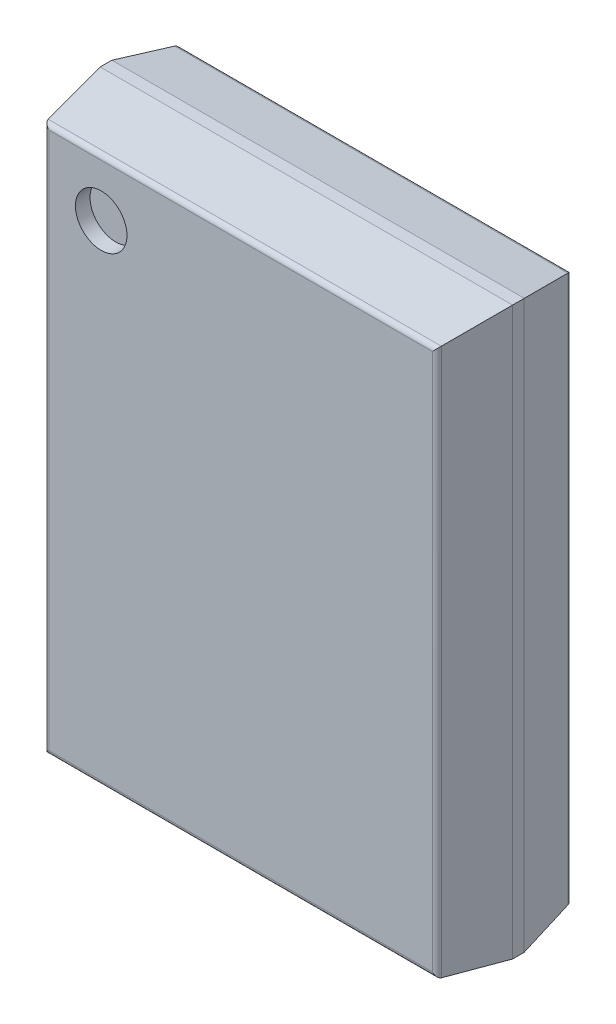
ISO-10303-21;
HEADER;
FILE_DESCRIPTION(('STEP AP214'),'2;1');
FILE_NAME('part.step','',(''),(''),'','','');
FILE_SCHEMA(('AUTOMOTIVE_DESIGN { 1 0 10303 214 1 1 1 1 }'));
ENDSEC;
DATA;
#1=APPLICATION_CONTEXT('core data for automotive mechanical design processes');
#2=APPLICATION_PROTOCOL_DEFINITION('international standard','automotive_design',2000,#1);
#3=PRODUCT_CONTEXT('',#1,'mechanical');
#4=PRODUCT('Part','Part','',(#3));
#5=PRODUCT_RELATED_PRODUCT_CATEGORY('part','',(#4));
#6=PRODUCT_DEFINITION_FORMATION('','',#4);
#7=PRODUCT_DEFINITION_CONTEXT('part definition',#1,'design');
#8=PRODUCT_DEFINITION('design','',#6,#7);
#9=PRODUCT_DEFINITION_SHAPE('','',#8);
#10=(LENGTH_UNIT() NAMED_UNIT(*) SI_UNIT(.MILLI.,.METRE.));
#11=(NAMED_UNIT(*) PLANE_ANGLE_UNIT() SI_UNIT($,.RADIAN.));
#12=(NAMED_UNIT(*) SI_UNIT($,.STERADIAN.) SOLID_ANGLE_UNIT());
#13=UNCERTAINTY_MEASURE_WITH_UNIT(LENGTH_MEASURE(1.E-05),#10,'distance_accuracy_value','');
#14=(GEOMETRIC_REPRESENTATION_CONTEXT(3) GLOBAL_UNCERTAINTY_ASSIGNED_CONTEXT((#13)) GLOBAL_UNIT_ASSIGNED_CONTEXT((#10,
#11,#12)) REPRESENTATION_CONTEXT('',''));
#15=CARTESIAN_POINT('',(0.,0.,0.));
#16=DIRECTION('',(0.,0.,1.));
#17=DIRECTION('',(1.,0.,0.));
#18=AXIS2_PLACEMENT_3D('',#15,#16,#17);
#19=CARTESIAN_POINT('',(-2.535,3.935,2.385));
#20=DIRECTION('',(0.,0.,1.));
#21=DIRECTION('',(1.,0.,0.));
#22=AXIS2_PLACEMENT_3D('',#19,#20,#21);
#23=PLANE('',#22);
#24=CARTESIAN_POINT('',(-2.535,3.935,2.385));
#25=DIRECTION('',(0.,0.,1.));
#26=DIRECTION('',(1.,0.,0.));
#27=AXIS2_PLACEMENT_3D('',#24,#25,#26);
#28=CIRCLE('',#27,0.46875);
#29=CARTESIAN_POINT('',(-2.06625,3.935,2.385));
#30=VERTEX_POINT('',#29);
#31=EDGE_CURVE('E11',#30,#30,#28,.T.);
#32=ORIENTED_EDGE('',*,*,#31,.T.);
#33=EDGE_LOOP('',(#32));
#34=FACE_BOUND('',#33,.T.);
#35=ADVANCED_FACE('F17',(#34),#23,.T.);
#36=CARTESIAN_POINT('',(-2.535,3.935,2.385));
#37=DIRECTION('',(0.,0.,1.));
#38=DIRECTION('',(1.,0.,0.));
#39=AXIS2_PLACEMENT_3D('',#36,#37,#38);
#40=CYLINDRICAL_SURFACE('',#39,0.46875);
#41=DIRECTION('',(0.,0.,1.));
#42=VECTOR('',#41,1.);
#43=CARTESIAN_POINT('',(-2.06625,3.935,2.385));
#44=LINE('',#43,#42);
#45=CARTESIAN_POINT('',(-2.06625,3.935,2.65));
#46=VERTEX_POINT('',#45);
#47=EDGE_CURVE('E26',#30,#46,#44,.T.);
#48=ORIENTED_EDGE('',*,*,#47,.T.);
#49=CARTESIAN_POINT('',(-2.535,3.935,2.65));
#50=DIRECTION('',(0.,0.,1.));
#51=DIRECTION('',(1.,0.,0.));
#52=AXIS2_PLACEMENT_3D('',#49,#50,#51);
#53=CIRCLE('',#52,0.46875);
#54=EDGE_CURVE('E251',#46,#46,#53,.T.);
#55=ORIENTED_EDGE('',*,*,#54,.T.);
#56=ORIENTED_EDGE('',*,*,#47,.F.);
#57=ORIENTED_EDGE('',*,*,#31,.F.);
#58=EDGE_LOOP('',(#48,#55,#56,#57));
#59=FACE_BOUND('',#58,.T.);
#60=ADVANCED_FACE('F537',(#59),#40,.F.);
#61=CARTESIAN_POINT('',(3.485510490825,-4.9625,2.56));
#62=DIRECTION('',(0.,1.,0.));
#63=DIRECTION('',(0.,0.,1.));
#64=AXIS2_PLACEMENT_3D('',#61,#62,#63);
#65=CYLINDRICAL_SURFACE('',#64,0.09);
#66=CARTESIAN_POINT('',(3.485510490825,-4.885510490825,2.56));
#67=DIRECTION('',(-0.707106781186548,-0.707106781186548,0.));
#68=DIRECTION('',(0.707106781186548,-0.707106781186548,0.));
#69=AXIS2_PLACEMENT_3D('',#66,#67,#68);
#70=ELLIPSE('',#69,0.127279220614,0.09);
#71=CARTESIAN_POINT('',(3.574424432451,-4.974424432451,2.573939547505));
#72=VERTEX_POINT('',#71);
#73=CARTESIAN_POINT('',(3.485510490825,-4.885510490825,2.65));
#74=VERTEX_POINT('',#73);
#75=EDGE_CURVE('E265',#72,#74,#70,.T.);
#76=ORIENTED_EDGE('',*,*,#75,.F.);
#77=DIRECTION('',(0.,1.,0.));
#78=VECTOR('',#77,1.);
#79=CARTESIAN_POINT('',(3.574424432451,-4.9625,2.573939547505));
#80=LINE('',#79,#78);
#81=CARTESIAN_POINT('',(3.574424432451,4.974424432451,2.573939547505));
#82=VERTEX_POINT('',#81);
#83=EDGE_CURVE('E228',#72,#82,#80,.T.);
#84=ORIENTED_EDGE('',*,*,#83,.T.);
#85=CARTESIAN_POINT('',(3.485510490825,4.885510490825,2.56));
#86=DIRECTION('',(-0.707106781186548,0.707106781186548,0.));
#87=DIRECTION('',(0.707106781186548,0.707106781186548,0.));
#88=AXIS2_PLACEMENT_3D('',#85,#86,#87);
#89=ELLIPSE('',#88,0.127279220614,0.09);
#90=CARTESIAN_POINT('',(3.485510490825,4.885510490825,2.65));
#91=VERTEX_POINT('',#90);
#92=EDGE_CURVE('E20',#91,#82,#89,.T.);
#93=ORIENTED_EDGE('',*,*,#92,.F.);
#94=DIRECTION('',(0.,1.,0.));
#95=VECTOR('',#94,1.);
#96=CARTESIAN_POINT('',(3.485510490825,-4.9625,2.65));
#97=LINE('',#96,#95);
#98=EDGE_CURVE('E328',#74,#91,#97,.T.);
#99=ORIENTED_EDGE('',*,*,#98,.F.);
#100=EDGE_LOOP('',(#76,#84,#93,#99));
#101=FACE_BOUND('',#100,.T.);
#102=ADVANCED_FACE('F342',(#101),#65,.T.);
#103=CARTESIAN_POINT('',(-3.5625,4.885510490825,2.56));
#104=DIRECTION('',(1.,0.,0.));
#105=DIRECTION('',(0.,0.,1.));
#106=AXIS2_PLACEMENT_3D('',#103,#104,#105);
#107=CYLINDRICAL_SURFACE('',#106,0.09);
#108=DIRECTION('',(1.,0.,0.));
#109=VECTOR('',#108,1.);
#110=CARTESIAN_POINT('',(-3.5625,4.885510490825,2.65));
#111=LINE('',#110,#109);
#112=CARTESIAN_POINT('',(-3.485510490825,4.885510490825,2.65));
#113=VERTEX_POINT('',#112);
#114=EDGE_CURVE('E254',#113,#91,#111,.T.);
#115=ORIENTED_EDGE('',*,*,#114,.T.);
#116=ORIENTED_EDGE('',*,*,#92,.T.);
#117=DIRECTION('',(1.,0.,0.));
#118=VECTOR('',#117,1.);
#119=CARTESIAN_POINT('',(-3.5625,4.974424432451,2.573939547505));
#120=LINE('',#119,#118);
#121=CARTESIAN_POINT('',(-3.574424432451,4.974424432451,2.573939547505));
#122=VERTEX_POINT('',#121);
#123=EDGE_CURVE('E218',#122,#82,#120,.T.);
#124=ORIENTED_EDGE('',*,*,#123,.F.);
#125=CARTESIAN_POINT('',(-3.485510490825,4.885510490825,2.56));
#126=DIRECTION('',(0.707106781186548,0.707106781186548,0.));
#127=DIRECTION('',(-0.707106781186548,0.707106781186548,0.));
#128=AXIS2_PLACEMENT_3D('',#125,#126,#127);
#129=ELLIPSE('',#128,0.127279220614,0.09);
#130=EDGE_CURVE('E223',#122,#113,#129,.T.);
#131=ORIENTED_EDGE('',*,*,#130,.T.);
#132=EDGE_LOOP('',(#115,#116,#124,#131));
#133=FACE_BOUND('',#132,.T.);
#134=ADVANCED_FACE('F336',(#133),#107,.T.);
#135=CARTESIAN_POINT('',(-3.75,-5.15,2.65));
#136=DIRECTION('',(0.,0.,1.));
#137=DIRECTION('',(1.,0.,0.));
#138=AXIS2_PLACEMENT_3D('',#135,#136,#137);
#139=PLANE('',#138);
#140=ORIENTED_EDGE('',*,*,#54,.F.);
#141=EDGE_LOOP('',(#140));
#142=FACE_BOUND('',#141,.T.);
#143=DIRECTION('',(0.,1.,0.));
#144=VECTOR('',#143,1.);
#145=CARTESIAN_POINT('',(-3.485510490825,-4.9625,2.65));
#146=LINE('',#145,#144);
#147=CARTESIAN_POINT('',(-3.485510490825,-4.885510490825,2.65));
#148=VERTEX_POINT('',#147);
#149=EDGE_CURVE('E277',#148,#113,#146,.T.);
#150=ORIENTED_EDGE('',*,*,#149,.F.);
#151=DIRECTION('',(1.,0.,0.));
#152=VECTOR('',#151,1.);
#153=CARTESIAN_POINT('',(-3.5625,-4.885510490825,2.65));
#154=LINE('',#153,#152);
#155=EDGE_CURVE('E269',#148,#74,#154,.T.);
#156=ORIENTED_EDGE('',*,*,#155,.T.);
#157=ORIENTED_EDGE('',*,*,#98,.T.);
#158=ORIENTED_EDGE('',*,*,#114,.F.);
#159=EDGE_LOOP('',(#150,#156,#157,#158));
#160=FACE_BOUND('',#159,.T.);
#161=ADVANCED_FACE('F340',(#142,#160),#139,.T.);
#162=CARTESIAN_POINT('',(-3.5625,-4.885510490825,2.56));
#163=DIRECTION('',(1.,0.,0.));
#164=DIRECTION('',(0.,-0.987932684725733,0.154883861168958));
#165=AXIS2_PLACEMENT_3D('',#162,#163,#164);
#166=CYLINDRICAL_SURFACE('',#165,0.09);
#167=DIRECTION('',(1.,0.,0.));
#168=VECTOR('',#167,1.);
#169=CARTESIAN_POINT('',(-3.5625,-4.974424432451,2.573939547505));
#170=LINE('',#169,#168);
#171=CARTESIAN_POINT('',(-3.574424432451,-4.974424432451,2.573939547505));
#172=VERTEX_POINT('',#171);
#173=EDGE_CURVE('E242',#172,#72,#170,.T.);
#174=ORIENTED_EDGE('',*,*,#173,.T.);
#175=ORIENTED_EDGE('',*,*,#75,.T.);
#176=ORIENTED_EDGE('',*,*,#155,.F.);
#177=CARTESIAN_POINT('',(-3.485510490825,-4.885510490825,2.56));
#178=DIRECTION('',(-0.707106781186548,0.707106781186548,0.));
#179=DIRECTION('',(0.707106781186548,0.707106781186548,0.));
#180=AXIS2_PLACEMENT_3D('',#177,#178,#179);
#181=ELLIPSE('',#180,0.127279220614,0.09);
#182=EDGE_CURVE('E281',#172,#148,#181,.T.);
#183=ORIENTED_EDGE('',*,*,#182,.F.);
#184=EDGE_LOOP('',(#174,#175,#176,#183));
#185=FACE_BOUND('',#184,.T.);
#186=ADVANCED_FACE('F519',(#185),#166,.T.);
#187=CARTESIAN_POINT('',(3.65625,-5.15,2.052012007618));
#188=DIRECTION('',(0.987932684725733,0.,0.154883861168958));
#189=DIRECTION('',(0.,-1.,0.));
#190=AXIS2_PLACEMENT_3D('',#187,#188,#189);
#191=PLANE('',#190);
#192=DIRECTION('',(-0.153058875720051,0.153058875720051,0.976291944618324));
#193=VECTOR('',#192,1.);
#194=CARTESIAN_POINT('',(3.570594960185,-4.970594960185,2.598365984115));
#195=LINE('',#194,#193);
#196=CARTESIAN_POINT('',(3.75,-5.15,1.454024015237));
#197=VERTEX_POINT('',#196);
#198=EDGE_CURVE('E238',#197,#72,#195,.T.);
#199=ORIENTED_EDGE('',*,*,#198,.F.);
#200=DIRECTION('',(0.,1.,0.));
#201=VECTOR('',#200,1.);
#202=CARTESIAN_POINT('',(3.75,-5.15,1.454024015237));
#203=LINE('',#202,#201);
#204=CARTESIAN_POINT('',(3.75,5.15,1.454024015237));
#205=VERTEX_POINT('',#204);
#206=EDGE_CURVE('E243',#197,#205,#203,.T.);
#207=ORIENTED_EDGE('',*,*,#206,.T.);
#208=DIRECTION('',(-0.153058875720051,-0.153058875720051,0.976291944618324));
#209=VECTOR('',#208,1.);
#210=CARTESIAN_POINT('',(3.449945810086,4.849945810086,3.367931243316));
#211=LINE('',#210,#209);
#212=EDGE_CURVE('E222',#205,#82,#211,.T.);
#213=ORIENTED_EDGE('',*,*,#212,.T.);
#214=ORIENTED_EDGE('',*,*,#83,.F.);
#215=EDGE_LOOP('',(#199,#207,#213,#214));
#216=FACE_BOUND('',#215,.T.);
#217=ADVANCED_FACE('F532',(#216),#191,.T.);
#218=CARTESIAN_POINT('',(-3.75,5.05625,2.052012007618));
#219=DIRECTION('',(0.,0.987932684725733,0.154883861168958));
#220=DIRECTION('',(1.,0.,0.));
#221=AXIS2_PLACEMENT_3D('',#218,#219,#220);
#222=PLANE('',#221);
#223=ORIENTED_EDGE('',*,*,#123,.T.);
#224=ORIENTED_EDGE('',*,*,#212,.F.);
#225=DIRECTION('',(1.,0.,0.));
#226=VECTOR('',#225,1.);
#227=CARTESIAN_POINT('',(-3.75,5.15,1.454024015237));
#228=LINE('',#227,#226);
#229=CARTESIAN_POINT('',(-3.75,5.15,1.454024015237));
#230=VERTEX_POINT('',#229);
#231=EDGE_CURVE('E306',#230,#205,#228,.T.);
#232=ORIENTED_EDGE('',*,*,#231,.F.);
#233=DIRECTION('',(0.153058875720051,-0.153058875720051,0.976291944618324));
#234=VECTOR('',#233,1.);
#235=CARTESIAN_POINT('',(-3.537797132973,4.937797132973,2.807568190499));
#236=LINE('',#235,#234);
#237=EDGE_CURVE('E195',#230,#122,#236,.T.);
#238=ORIENTED_EDGE('',*,*,#237,.T.);
#239=EDGE_LOOP('',(#223,#224,#232,#238));
#240=FACE_BOUND('',#239,.T.);
#241=ADVANCED_FACE('F523',(#240),#222,.T.);
#242=CARTESIAN_POINT('',(-3.485510490825,-4.9625,2.56));
#243=DIRECTION('',(0.,1.,0.));
#244=DIRECTION('',(-0.987932684725733,0.,0.154883861168958));
#245=AXIS2_PLACEMENT_3D('',#242,#243,#244);
#246=CYLINDRICAL_SURFACE('',#245,0.09);
#247=ORIENTED_EDGE('',*,*,#182,.T.);
#248=ORIENTED_EDGE('',*,*,#149,.T.);
#249=ORIENTED_EDGE('',*,*,#130,.F.);
#250=DIRECTION('',(0.,1.,0.));
#251=VECTOR('',#250,1.);
#252=CARTESIAN_POINT('',(-3.574424432451,-4.9625,2.573939547505));
#253=LINE('',#252,#251);
#254=EDGE_CURVE('E200',#172,#122,#253,.T.);
#255=ORIENTED_EDGE('',*,*,#254,.F.);
#256=EDGE_LOOP('',(#247,#248,#249,#255));
#257=FACE_BOUND('',#256,.T.);
#258=ADVANCED_FACE('F521',(#257),#246,.T.);
#259=CARTESIAN_POINT('',(-3.75,-5.05625,2.052012007618));
#260=DIRECTION('',(0.,0.987932684725733,-0.154883861168958));
#261=DIRECTION('',(-1.,0.,0.));
#262=AXIS2_PLACEMENT_3D('',#259,#260,#261);
#263=PLANE('',#262);
#264=DIRECTION('',(0.153058875720051,0.153058875720051,0.976291944618324));
#265=VECTOR('',#264,1.);
#266=CARTESIAN_POINT('',(-3.658446283072,-5.058446283072,2.038002931298));
#267=LINE('',#266,#265);
#268=CARTESIAN_POINT('',(-3.75,-5.15,1.454024015237));
#269=VERTEX_POINT('',#268);
#270=EDGE_CURVE('E199',#269,#172,#267,.T.);
#271=ORIENTED_EDGE('',*,*,#270,.F.);
#272=DIRECTION('',(1.,0.,0.));
#273=VECTOR('',#272,1.);
#274=CARTESIAN_POINT('',(-3.75,-5.15,1.454024015237));
#275=LINE('',#274,#273);
#276=EDGE_CURVE('E150',#269,#197,#275,.T.);
#277=ORIENTED_EDGE('',*,*,#276,.T.);
#278=ORIENTED_EDGE('',*,*,#198,.T.);
#279=ORIENTED_EDGE('',*,*,#173,.F.);
#280=EDGE_LOOP('',(#271,#277,#278,#279));
#281=FACE_BOUND('',#280,.T.);
#282=ADVANCED_FACE('F516',(#281),#263,.F.);
#283=CARTESIAN_POINT('',(3.75,-5.15,0.2));
#284=DIRECTION('',(1.,0.,0.));
#285=DIRECTION('',(0.,1.,0.));
#286=AXIS2_PLACEMENT_3D('',#283,#284,#285);
#287=PLANE('',#286);
#288=DIRECTION('',(0.,0.,1.));
#289=VECTOR('',#288,1.);
#290=CARTESIAN_POINT('',(3.75,-5.15,0.2));
#291=LINE('',#290,#289);
#292=CARTESIAN_POINT('',(3.75,-5.15,1.241524015237));
#293=VERTEX_POINT('',#292);
#294=EDGE_CURVE('E208',#293,#197,#291,.T.);
#295=ORIENTED_EDGE('',*,*,#294,.F.);
#296=DIRECTION('',(0.,1.,0.));
#297=VECTOR('',#296,1.);
#298=CARTESIAN_POINT('',(3.75,-5.15,1.241524015237));
#299=LINE('',#298,#297);
#300=CARTESIAN_POINT('',(3.75,5.15,1.241524015237));
#301=VERTEX_POINT('',#300);
#302=EDGE_CURVE('E207',#293,#301,#299,.T.);
#303=ORIENTED_EDGE('',*,*,#302,.T.);
#304=DIRECTION('',(0.,0.,1.));
#305=VECTOR('',#304,1.);
#306=CARTESIAN_POINT('',(3.75,5.15,0.2));
#307=LINE('',#306,#305);
#308=EDGE_CURVE('E302',#301,#205,#307,.T.);
#309=ORIENTED_EDGE('',*,*,#308,.T.);
#310=ORIENTED_EDGE('',*,*,#206,.F.);
#311=EDGE_LOOP('',(#295,#303,#309,#310));
#312=FACE_BOUND('',#311,.T.);
#313=ADVANCED_FACE('F514',(#312),#287,.T.);
#314=CARTESIAN_POINT('',(3.487255447992,-4.9625,0.29));
#315=DIRECTION('',(0.,1.,0.));
#316=DIRECTION('',(0.,0.,-1.));
#317=AXIS2_PLACEMENT_3D('',#314,#315,#316);
#318=CYLINDRICAL_SURFACE('',#317,0.09);
#319=DIRECTION('',(0.,1.,0.));
#320=VECTOR('',#319,1.);
#321=CARTESIAN_POINT('',(3.487255447992,-4.9625,0.2));
#322=LINE('',#321,#320);
#323=CARTESIAN_POINT('',(3.487255447992,-4.887255447992,0.2));
#324=VERTEX_POINT('',#323);
#325=CARTESIAN_POINT('',(3.487255447992,4.887255447992,0.2));
#326=VERTEX_POINT('',#325);
#327=EDGE_CURVE('E289',#324,#326,#322,.T.);
#328=ORIENTED_EDGE('',*,*,#327,.T.);
#329=CARTESIAN_POINT('',(3.487255447992,4.887255447992,0.29));
#330=DIRECTION('',(0.707106781186548,-0.707106781186548,0.));
#331=DIRECTION('',(0.707106781186548,0.707106781186548,0.));
#332=AXIS2_PLACEMENT_3D('',#329,#330,#331);
#333=ELLIPSE('',#332,0.127279220614,0.09);
#334=CARTESIAN_POINT('',(3.575831566391,4.975831566391,0.274054114973));
#335=VERTEX_POINT('',#334);
#336=EDGE_CURVE('E292',#326,#335,#333,.T.);
#337=ORIENTED_EDGE('',*,*,#336,.T.);
#338=DIRECTION('',(0.,1.,0.));
#339=VECTOR('',#338,1.);
#340=CARTESIAN_POINT('',(3.575831566391,-4.9625,0.274054114973));
#341=LINE('',#340,#339);
#342=CARTESIAN_POINT('',(3.575831566391,-4.975831566391,0.274054114973));
#343=VERTEX_POINT('',#342);
#344=EDGE_CURVE('E203',#343,#335,#341,.T.);
#345=ORIENTED_EDGE('',*,*,#344,.F.);
#346=CARTESIAN_POINT('',(3.487255447992,-4.887255447992,0.29));
#347=DIRECTION('',(0.707106781186548,0.707106781186548,0.));
#348=DIRECTION('',(0.707106781186548,-0.707106781186548,0.));
#349=AXIS2_PLACEMENT_3D('',#346,#347,#348);
#350=ELLIPSE('',#349,0.127279220614,0.09);
#351=EDGE_CURVE('E264',#343,#324,#350,.T.);
#352=ORIENTED_EDGE('',*,*,#351,.T.);
#353=EDGE_LOOP('',(#328,#337,#345,#352));
#354=FACE_BOUND('',#353,.T.);
#355=ADVANCED_FACE('F622',(#354),#318,.T.);
#356=CARTESIAN_POINT('',(-3.75,5.15,0.2));
#357=DIRECTION('',(0.,1.,0.));
#358=DIRECTION('',(1.,0.,0.));
#359=AXIS2_PLACEMENT_3D('',#356,#357,#358);
#360=PLANE('',#359);
#361=ORIENTED_EDGE('',*,*,#308,.F.);
#362=DIRECTION('',(1.,0.,0.));
#363=VECTOR('',#362,1.);
#364=CARTESIAN_POINT('',(-3.75,5.15,1.241524015237));
#365=LINE('',#364,#363);
#366=CARTESIAN_POINT('',(-3.75,5.15,1.241524015237));
#367=VERTEX_POINT('',#366);
#368=EDGE_CURVE('E156',#367,#301,#365,.T.);
#369=ORIENTED_EDGE('',*,*,#368,.F.);
#370=DIRECTION('',(0.,0.,1.));
#371=VECTOR('',#370,1.);
#372=CARTESIAN_POINT('',(-3.75,5.15,0.2));
#373=LINE('',#372,#371);
#374=EDGE_CURVE('E157',#367,#230,#373,.T.);
#375=ORIENTED_EDGE('',*,*,#374,.T.);
#376=ORIENTED_EDGE('',*,*,#231,.T.);
#377=EDGE_LOOP('',(#361,#369,#375,#376));
#378=FACE_BOUND('',#377,.T.);
#379=ADVANCED_FACE('F494',(#378),#360,.T.);
#380=CARTESIAN_POINT('',(-3.65625,-5.15,2.052012007618));
#381=DIRECTION('',(0.987932684725733,0.,-0.154883861168958));
#382=DIRECTION('',(0.,-1.,0.));
#383=AXIS2_PLACEMENT_3D('',#380,#381,#382);
#384=PLANE('',#383);
#385=ORIENTED_EDGE('',*,*,#254,.T.);
#386=ORIENTED_EDGE('',*,*,#237,.F.);
#387=DIRECTION('',(0.,1.,0.));
#388=VECTOR('',#387,1.);
#389=CARTESIAN_POINT('',(-3.75,-5.15,1.454024015237));
#390=LINE('',#389,#388);
#391=EDGE_CURVE('E191',#269,#230,#390,.T.);
#392=ORIENTED_EDGE('',*,*,#391,.F.);
#393=ORIENTED_EDGE('',*,*,#270,.T.);
#394=EDGE_LOOP('',(#385,#386,#392,#393));
#395=FACE_BOUND('',#394,.T.);
#396=ADVANCED_FACE('F490',(#395),#384,.F.);
#397=CARTESIAN_POINT('',(-3.5625,4.887255447992,0.29));
#398=DIRECTION('',(1.,0.,0.));
#399=DIRECTION('',(0.,0.,-1.));
#400=AXIS2_PLACEMENT_3D('',#397,#398,#399);
#401=CYLINDRICAL_SURFACE('',#400,0.09);
#402=CARTESIAN_POINT('',(-3.487255447992,4.887255447992,0.29));
#403=DIRECTION('',(-0.707106781186548,-0.707106781186548,0.));
#404=DIRECTION('',(-0.707106781186548,0.707106781186548,0.));
#405=AXIS2_PLACEMENT_3D('',#402,#403,#404);
#406=ELLIPSE('',#405,0.127279220614,0.09);
#407=CARTESIAN_POINT('',(-3.575831566391,4.975831566391,0.274054114973));
#408=VERTEX_POINT('',#407);
#409=CARTESIAN_POINT('',(-3.487255447992,4.887255447992,0.2));
#410=VERTEX_POINT('',#409);
#411=EDGE_CURVE('E168',#408,#410,#406,.T.);
#412=ORIENTED_EDGE('',*,*,#411,.F.);
#413=DIRECTION('',(1.,0.,0.));
#414=VECTOR('',#413,1.);
#415=CARTESIAN_POINT('',(-3.5625,4.975831566391,0.274054114973));
#416=LINE('',#415,#414);
#417=EDGE_CURVE('E232',#408,#335,#416,.T.);
#418=ORIENTED_EDGE('',*,*,#417,.T.);
#419=ORIENTED_EDGE('',*,*,#336,.F.);
#420=DIRECTION('',(1.,0.,0.));
#421=VECTOR('',#420,1.);
#422=CARTESIAN_POINT('',(-3.5625,4.887255447992,0.2));
#423=LINE('',#422,#421);
#424=EDGE_CURVE('E285',#410,#326,#423,.T.);
#425=ORIENTED_EDGE('',*,*,#424,.F.);
#426=EDGE_LOOP('',(#412,#418,#419,#425));
#427=FACE_BOUND('',#426,.T.);
#428=ADVANCED_FACE('F500',(#427),#401,.T.);
#429=CARTESIAN_POINT('',(-3.75,-5.15,0.2));
#430=DIRECTION('',(0.,0.,1.));
#431=DIRECTION('',(1.,0.,0.));
#432=AXIS2_PLACEMENT_3D('',#429,#430,#431);
#433=PLANE('',#432);
#434=ORIENTED_EDGE('',*,*,#424,.T.);
#435=ORIENTED_EDGE('',*,*,#327,.F.);
#436=DIRECTION('',(1.,0.,0.));
#437=VECTOR('',#436,1.);
#438=CARTESIAN_POINT('',(-3.5625,-4.887255447992,0.2));
#439=LINE('',#438,#437);
#440=CARTESIAN_POINT('',(-3.487255447992,-4.887255447992,0.2));
#441=VERTEX_POINT('',#440);
#442=EDGE_CURVE('E236',#441,#324,#439,.T.);
#443=ORIENTED_EDGE('',*,*,#442,.F.);
#444=DIRECTION('',(0.,1.,0.));
#445=VECTOR('',#444,1.);
#446=CARTESIAN_POINT('',(-3.487255447992,-4.9625,0.2));
#447=LINE('',#446,#445);
#448=EDGE_CURVE('E214',#441,#410,#447,.T.);
#449=ORIENTED_EDGE('',*,*,#448,.T.);
#450=EDGE_LOOP('',(#434,#435,#443,#449));
#451=FACE_BOUND('',#450,.T.);
#452=ADVANCED_FACE('F643',(#451),#433,.F.);
#453=CARTESIAN_POINT('',(3.65625,-5.15,0.720762007618));
#454=DIRECTION('',(-0.984179093326574,0.,0.177176500300924));
#455=DIRECTION('',(0.,1.,0.));
#456=AXIS2_PLACEMENT_3D('',#453,#454,#455);
#457=PLANE('',#456);
#458=ORIENTED_EDGE('',*,*,#344,.T.);
#459=DIRECTION('',(-0.174459387110067,-0.174459387110067,-0.969086087248372));
#460=VECTOR('',#459,1.);
#461=CARTESIAN_POINT('',(3.388222290306,4.788222290306,-0.768076906491));
#462=LINE('',#461,#460);
#463=EDGE_CURVE('E237',#301,#335,#462,.T.);
#464=ORIENTED_EDGE('',*,*,#463,.F.);
#465=ORIENTED_EDGE('',*,*,#302,.F.);
#466=DIRECTION('',(-0.174459387110067,0.174459387110067,-0.969086087248372));
#467=VECTOR('',#466,1.);
#468=CARTESIAN_POINT('',(3.544968090723,-4.944968090723,0.102613842427));
#469=LINE('',#468,#467);
#470=EDGE_CURVE('E166',#293,#343,#469,.T.);
#471=ORIENTED_EDGE('',*,*,#470,.T.);
#472=EDGE_LOOP('',(#458,#464,#465,#471));
#473=FACE_BOUND('',#472,.T.);
#474=ADVANCED_FACE('F510',(#473),#457,.F.);
#475=CARTESIAN_POINT('',(-3.75,-5.15,0.2));
#476=DIRECTION('',(0.,1.,0.));
#477=DIRECTION('',(1.,0.,0.));
#478=AXIS2_PLACEMENT_3D('',#475,#476,#477);
#479=PLANE('',#478);
#480=ORIENTED_EDGE('',*,*,#276,.F.);
#481=DIRECTION('',(0.,0.,1.));
#482=VECTOR('',#481,1.);
#483=CARTESIAN_POINT('',(-3.75,-5.15,0.2));
#484=LINE('',#483,#482);
#485=CARTESIAN_POINT('',(-3.75,-5.15,1.241524015237));
#486=VERTEX_POINT('',#485);
#487=EDGE_CURVE('E143',#486,#269,#484,.T.);
#488=ORIENTED_EDGE('',*,*,#487,.F.);
#489=DIRECTION('',(1.,0.,0.));
#490=VECTOR('',#489,1.);
#491=CARTESIAN_POINT('',(-3.75,-5.15,1.241524015237));
#492=LINE('',#491,#490);
#493=EDGE_CURVE('E147',#486,#293,#492,.T.);
#494=ORIENTED_EDGE('',*,*,#493,.T.);
#495=ORIENTED_EDGE('',*,*,#294,.T.);
#496=EDGE_LOOP('',(#480,#488,#494,#495));
#497=FACE_BOUND('',#496,.T.);
#498=ADVANCED_FACE('F145',(#497),#479,.F.);
#499=CARTESIAN_POINT('',(-3.5625,-4.887255447992,0.29));
#500=DIRECTION('',(1.,0.,0.));
#501=DIRECTION('',(0.,-0.984179093326574,-0.177176500300923));
#502=AXIS2_PLACEMENT_3D('',#499,#500,#501);
#503=CYLINDRICAL_SURFACE('',#502,0.09);
#504=CARTESIAN_POINT('',(-3.487255447992,-4.887255447992,0.29));
#505=DIRECTION('',(0.707106781186548,-0.707106781186548,0.));
#506=DIRECTION('',(0.707106781186548,0.707106781186548,0.));
#507=AXIS2_PLACEMENT_3D('',#504,#505,#506);
#508=ELLIPSE('',#507,0.127279220614,0.09);
#509=CARTESIAN_POINT('',(-3.575831566391,-4.975831566391,0.274054114973));
#510=VERTEX_POINT('',#509);
#511=EDGE_CURVE('E247',#510,#441,#508,.T.);
#512=ORIENTED_EDGE('',*,*,#511,.T.);
#513=ORIENTED_EDGE('',*,*,#442,.T.);
#514=ORIENTED_EDGE('',*,*,#351,.F.);
#515=DIRECTION('',(1.,0.,0.));
#516=VECTOR('',#515,1.);
#517=CARTESIAN_POINT('',(-3.5625,-4.975831566391,0.274054114973));
#518=LINE('',#517,#516);
#519=EDGE_CURVE('E217',#510,#343,#518,.T.);
#520=ORIENTED_EDGE('',*,*,#519,.F.);
#521=EDGE_LOOP('',(#512,#513,#514,#520));
#522=FACE_BOUND('',#521,.T.);
#523=ADVANCED_FACE('F507',(#522),#503,.T.);
#524=CARTESIAN_POINT('',(-3.75,5.05625,0.720762007618));
#525=DIRECTION('',(0.,-0.984179093326574,0.177176500300924));
#526=DIRECTION('',(-1.,0.,0.));
#527=AXIS2_PLACEMENT_3D('',#524,#525,#526);
#528=PLANE('',#527);
#529=DIRECTION('',(0.174459387110067,-0.174459387110067,-0.969086087248372));
#530=VECTOR('',#529,1.);
#531=CARTESIAN_POINT('',(-3.502357581872,4.902357581872,-0.134078788347));
#532=LINE('',#531,#530);
#533=EDGE_CURVE('E179',#367,#408,#532,.T.);
#534=ORIENTED_EDGE('',*,*,#533,.F.);
#535=ORIENTED_EDGE('',*,*,#368,.T.);
#536=ORIENTED_EDGE('',*,*,#463,.T.);
#537=ORIENTED_EDGE('',*,*,#417,.F.);
#538=EDGE_LOOP('',(#534,#535,#536,#537));
#539=FACE_BOUND('',#538,.T.);
#540=ADVANCED_FACE('F496',(#539),#528,.F.);
#541=CARTESIAN_POINT('',(-3.75,-5.15,0.2));
#542=DIRECTION('',(1.,0.,0.));
#543=DIRECTION('',(0.,1.,0.));
#544=AXIS2_PLACEMENT_3D('',#541,#542,#543);
#545=PLANE('',#544);
#546=ORIENTED_EDGE('',*,*,#391,.T.);
#547=ORIENTED_EDGE('',*,*,#374,.F.);
#548=DIRECTION('',(0.,1.,0.));
#549=VECTOR('',#548,1.);
#550=CARTESIAN_POINT('',(-3.75,-5.15,1.241524015237));
#551=LINE('',#550,#549);
#552=EDGE_CURVE('E172',#486,#367,#551,.T.);
#553=ORIENTED_EDGE('',*,*,#552,.F.);
#554=ORIENTED_EDGE('',*,*,#487,.T.);
#555=EDGE_LOOP('',(#546,#547,#553,#554));
#556=FACE_BOUND('',#555,.T.);
#557=ADVANCED_FACE('F173',(#556),#545,.F.);
#558=CARTESIAN_POINT('',(-3.487255447992,-4.9625,0.29));
#559=DIRECTION('',(0.,1.,0.));
#560=DIRECTION('',(-0.984179093326574,0.,-0.177176500300923));
#561=AXIS2_PLACEMENT_3D('',#558,#559,#560);
#562=CYLINDRICAL_SURFACE('',#561,0.09);
#563=DIRECTION('',(0.,1.,0.));
#564=VECTOR('',#563,1.);
#565=CARTESIAN_POINT('',(-3.575831566391,-4.9625,0.274054114973));
#566=LINE('',#565,#564);
#567=EDGE_CURVE('E184',#510,#408,#566,.T.);
#568=ORIENTED_EDGE('',*,*,#567,.T.);
#569=ORIENTED_EDGE('',*,*,#411,.T.);
#570=ORIENTED_EDGE('',*,*,#448,.F.);
#571=ORIENTED_EDGE('',*,*,#511,.F.);
#572=EDGE_LOOP('',(#568,#569,#570,#571));
#573=FACE_BOUND('',#572,.T.);
#574=ADVANCED_FACE('F503',(#573),#562,.T.);
#575=CARTESIAN_POINT('',(-3.75,-5.05625,0.720762007618));
#576=DIRECTION('',(0.,-0.984179093326574,-0.177176500300924));
#577=DIRECTION('',(0.,0.177176500300924,-0.984179093326574));
#578=AXIS2_PLACEMENT_3D('',#575,#576,#577);
#579=PLANE('',#578);
#580=ORIENTED_EDGE('',*,*,#519,.T.);
#581=ORIENTED_EDGE('',*,*,#470,.F.);
#582=ORIENTED_EDGE('',*,*,#493,.F.);
#583=DIRECTION('',(0.174459387110067,0.174459387110067,-0.969086087248372));
#584=VECTOR('',#583,1.);
#585=CARTESIAN_POINT('',(-3.659103382289,-5.059103382289,0.736611960572));
#586=LINE('',#585,#584);
#587=EDGE_CURVE('E164',#486,#510,#586,.T.);
#588=ORIENTED_EDGE('',*,*,#587,.T.);
#589=EDGE_LOOP('',(#580,#581,#582,#588));
#590=FACE_BOUND('',#589,.T.);
#591=ADVANCED_FACE('F162',(#590),#579,.T.);
#592=CARTESIAN_POINT('',(-3.65625,-5.15,0.720762007618));
#593=DIRECTION('',(-0.984179093326574,0.,-0.177176500300924));
#594=DIRECTION('',(-0.177176500300924,0.,0.984179093326574));
#595=AXIS2_PLACEMENT_3D('',#592,#593,#594);
#596=PLANE('',#595);
#597=ORIENTED_EDGE('',*,*,#587,.F.);
#598=ORIENTED_EDGE('',*,*,#552,.T.);
#599=ORIENTED_EDGE('',*,*,#533,.T.);
#600=ORIENTED_EDGE('',*,*,#567,.F.);
#601=EDGE_LOOP('',(#597,#598,#599,#600));
#602=FACE_BOUND('',#601,.T.);
#603=ADVANCED_FACE('F182',(#602),#596,.T.);
#604=CLOSED_SHELL('',(#35,#60,#102,#134,#161,#186,#217,#241,#258,#282,#313,#355,#379,#396,#428,
#452,#474,#498,#523,#540,#557,#574,#591,#603));
#605=MANIFOLD_SOLID_BREP('B1',#604);
#606=ADVANCED_BREP_SHAPE_REPRESENTATION('',(#18,#605),#14);
#607=SHAPE_DEFINITION_REPRESENTATION(#9,#606);
ENDSEC;
END-ISO-10303-21;
